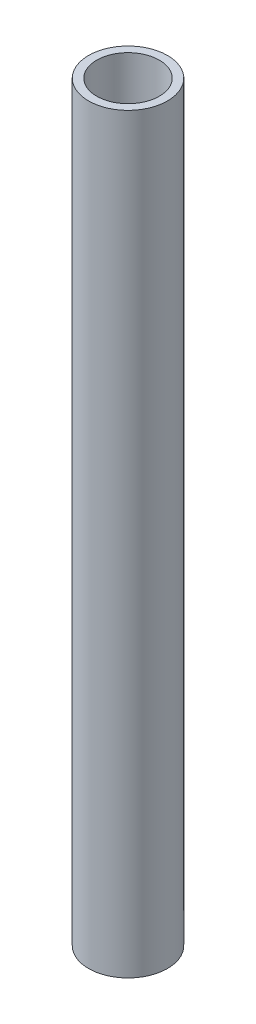
ISO-10303-21;
HEADER;
FILE_DESCRIPTION(('STEP AP214'),'2;1');
FILE_NAME('part.step','',(''),(''),'','','');
FILE_SCHEMA(('AUTOMOTIVE_DESIGN { 1 0 10303 214 1 1 1 1 }'));
ENDSEC;
DATA;
#1=APPLICATION_CONTEXT('core data for automotive mechanical design processes');
#2=APPLICATION_PROTOCOL_DEFINITION('international standard','automotive_design',2000,#1);
#3=PRODUCT_CONTEXT('',#1,'mechanical');
#4=PRODUCT('Part','Part','',(#3));
#5=PRODUCT_RELATED_PRODUCT_CATEGORY('part','',(#4));
#6=PRODUCT_DEFINITION_FORMATION('','',#4);
#7=PRODUCT_DEFINITION_CONTEXT('part definition',#1,'design');
#8=PRODUCT_DEFINITION('design','',#6,#7);
#9=PRODUCT_DEFINITION_SHAPE('','',#8);
#10=(LENGTH_UNIT() NAMED_UNIT(*) SI_UNIT(.MILLI.,.METRE.));
#11=(NAMED_UNIT(*) PLANE_ANGLE_UNIT() SI_UNIT($,.RADIAN.));
#12=(NAMED_UNIT(*) SI_UNIT($,.STERADIAN.) SOLID_ANGLE_UNIT());
#13=UNCERTAINTY_MEASURE_WITH_UNIT(LENGTH_MEASURE(1.E-05),#10,'distance_accuracy_value','');
#14=(GEOMETRIC_REPRESENTATION_CONTEXT(3) GLOBAL_UNCERTAINTY_ASSIGNED_CONTEXT((#13)) GLOBAL_UNIT_ASSIGNED_CONTEXT((#10,
#11,#12)) REPRESENTATION_CONTEXT('',''));
#15=CARTESIAN_POINT('',(0.,0.,0.));
#16=DIRECTION('',(0.,0.,1.));
#17=DIRECTION('',(1.,0.,0.));
#18=AXIS2_PLACEMENT_3D('',#15,#16,#17);
#19=CARTESIAN_POINT('',(0.,152.4,0.));
#20=DIRECTION('',(0.,1.,0.));
#21=DIRECTION('',(0.,0.,1.));
#22=AXIS2_PLACEMENT_3D('',#19,#20,#21);
#23=PLANE('',#22);
#24=CARTESIAN_POINT('',(0.,152.4,0.));
#25=DIRECTION('',(0.,1.,0.));
#26=DIRECTION('',(0.,0.,1.));
#27=AXIS2_PLACEMENT_3D('',#24,#25,#26);
#28=CIRCLE('',#27,8.001);
#29=CARTESIAN_POINT('',(0.,152.4,-8.001));
#30=VERTEX_POINT('',#29);
#31=EDGE_CURVE('E10',#30,#30,#28,.T.);
#32=ORIENTED_EDGE('',*,*,#31,.T.);
#33=EDGE_LOOP('',(#32));
#34=FACE_BOUND('',#33,.T.);
#35=CARTESIAN_POINT('',(0.,152.4,0.));
#36=DIRECTION('',(0.,1.,0.));
#37=DIRECTION('',(0.,0.,1.));
#38=AXIS2_PLACEMENT_3D('',#35,#36,#37);
#39=CIRCLE('',#38,6.35);
#40=CARTESIAN_POINT('',(0.,152.4,-6.35));
#41=VERTEX_POINT('',#40);
#42=EDGE_CURVE('E42',#41,#41,#39,.T.);
#43=ORIENTED_EDGE('',*,*,#42,.F.);
#44=EDGE_LOOP('',(#43));
#45=FACE_BOUND('',#44,.T.);
#46=ADVANCED_FACE('F31',(#34,#45),#23,.T.);
#47=CARTESIAN_POINT('',(0.,0.,0.));
#48=DIRECTION('',(0.,1.,0.));
#49=DIRECTION('',(0.,0.,1.));
#50=AXIS2_PLACEMENT_3D('',#47,#48,#49);
#51=PLANE('',#50);
#52=CARTESIAN_POINT('',(0.,0.,0.));
#53=DIRECTION('',(0.,1.,0.));
#54=DIRECTION('',(0.,0.,1.));
#55=AXIS2_PLACEMENT_3D('',#52,#53,#54);
#56=CIRCLE('',#55,8.001);
#57=CARTESIAN_POINT('',(0.,0.,-8.001));
#58=VERTEX_POINT('',#57);
#59=EDGE_CURVE('E35',#58,#58,#56,.T.);
#60=ORIENTED_EDGE('',*,*,#59,.F.);
#61=EDGE_LOOP('',(#60));
#62=FACE_BOUND('',#61,.T.);
#63=CARTESIAN_POINT('',(0.,0.,0.));
#64=DIRECTION('',(0.,1.,0.));
#65=DIRECTION('',(0.,0.,1.));
#66=AXIS2_PLACEMENT_3D('',#63,#64,#65);
#67=CIRCLE('',#66,6.35);
#68=CARTESIAN_POINT('',(0.,0.,-6.35));
#69=VERTEX_POINT('',#68);
#70=EDGE_CURVE('E44',#69,#69,#67,.T.);
#71=ORIENTED_EDGE('',*,*,#70,.T.);
#72=EDGE_LOOP('',(#71));
#73=FACE_BOUND('',#72,.T.);
#74=ADVANCED_FACE('F54',(#62,#73),#51,.F.);
#75=CARTESIAN_POINT('',(0.,152.4,0.));
#76=DIRECTION('',(0.,-1.,0.));
#77=DIRECTION('',(0.,0.,-1.));
#78=AXIS2_PLACEMENT_3D('',#75,#76,#77);
#79=CYLINDRICAL_SURFACE('',#78,8.001);
#80=CARTESIAN_POINT('',(0.,152.4,-8.001));
#81=CARTESIAN_POINT('',(0.,150.8125,-8.001));
#82=CARTESIAN_POINT('',(0.,149.225,-8.001));
#83=CARTESIAN_POINT('',(0.,146.05,-8.001));
#84=CARTESIAN_POINT('',(0.,144.4625,-8.001));
#85=CARTESIAN_POINT('',(0.,141.2875,-8.001));
#86=CARTESIAN_POINT('',(0.,139.7,-8.001));
#87=CARTESIAN_POINT('',(0.,136.525,-8.001));
#88=CARTESIAN_POINT('',(0.,134.9375,-8.001));
#89=CARTESIAN_POINT('',(0.,131.7625,-8.001));
#90=CARTESIAN_POINT('',(0.,130.175,-8.001));
#91=CARTESIAN_POINT('',(0.,127.,-8.001));
#92=CARTESIAN_POINT('',(0.,125.4125,-8.001));
#93=CARTESIAN_POINT('',(0.,122.2375,-8.001));
#94=CARTESIAN_POINT('',(0.,120.65,-8.001));
#95=CARTESIAN_POINT('',(0.,117.475,-8.001));
#96=CARTESIAN_POINT('',(0.,115.8875,-8.001));
#97=CARTESIAN_POINT('',(0.,112.7125,-8.001));
#98=CARTESIAN_POINT('',(0.,111.125,-8.001));
#99=CARTESIAN_POINT('',(0.,107.95,-8.001));
#100=CARTESIAN_POINT('',(0.,106.3625,-8.001));
#101=CARTESIAN_POINT('',(0.,103.1875,-8.001));
#102=CARTESIAN_POINT('',(0.,101.6,-8.001));
#103=CARTESIAN_POINT('',(0.,98.425,-8.001));
#104=CARTESIAN_POINT('',(0.,96.8375,-8.001));
#105=CARTESIAN_POINT('',(0.,93.6625,-8.001));
#106=CARTESIAN_POINT('',(0.,92.075,-8.001));
#107=CARTESIAN_POINT('',(0.,88.9,-8.001));
#108=CARTESIAN_POINT('',(0.,87.3125,-8.001));
#109=CARTESIAN_POINT('',(0.,84.1375,-8.001));
#110=CARTESIAN_POINT('',(0.,82.55,-8.001));
#111=CARTESIAN_POINT('',(0.,79.375,-8.001));
#112=CARTESIAN_POINT('',(0.,77.7875,-8.001));
#113=CARTESIAN_POINT('',(0.,74.6125,-8.001));
#114=CARTESIAN_POINT('',(0.,73.025,-8.001));
#115=CARTESIAN_POINT('',(0.,69.85,-8.001));
#116=CARTESIAN_POINT('',(0.,68.2625,-8.001));
#117=CARTESIAN_POINT('',(0.,65.0875,-8.001));
#118=CARTESIAN_POINT('',(0.,63.5,-8.001));
#119=CARTESIAN_POINT('',(0.,60.325,-8.001));
#120=CARTESIAN_POINT('',(0.,58.7375,-8.001));
#121=CARTESIAN_POINT('',(0.,55.5625,-8.001));
#122=CARTESIAN_POINT('',(0.,53.975,-8.001));
#123=CARTESIAN_POINT('',(0.,50.8,-8.001));
#124=CARTESIAN_POINT('',(0.,49.2125,-8.001));
#125=CARTESIAN_POINT('',(0.,46.0375,-8.001));
#126=CARTESIAN_POINT('',(0.,44.45,-8.001));
#127=CARTESIAN_POINT('',(0.,41.275,-8.001));
#128=CARTESIAN_POINT('',(0.,39.6875,-8.001));
#129=CARTESIAN_POINT('',(0.,36.5125,-8.001));
#130=CARTESIAN_POINT('',(0.,34.925,-8.001));
#131=CARTESIAN_POINT('',(0.,31.75,-8.001));
#132=CARTESIAN_POINT('',(0.,30.1625,-8.001));
#133=CARTESIAN_POINT('',(0.,26.9875,-8.001));
#134=CARTESIAN_POINT('',(0.,25.4,-8.001));
#135=CARTESIAN_POINT('',(0.,22.225,-8.001));
#136=CARTESIAN_POINT('',(0.,20.6375,-8.001));
#137=CARTESIAN_POINT('',(0.,17.4625,-8.001));
#138=CARTESIAN_POINT('',(0.,15.875,-8.001));
#139=CARTESIAN_POINT('',(0.,12.7,-8.001));
#140=CARTESIAN_POINT('',(0.,11.1125,-8.001));
#141=CARTESIAN_POINT('',(0.,7.93750000000001,-8.001));
#142=CARTESIAN_POINT('',(0.,6.35,-8.001));
#143=CARTESIAN_POINT('',(0.,3.175,-8.001));
#144=CARTESIAN_POINT('',(0.,1.5875,-8.001));
#145=CARTESIAN_POINT('',(0.,0.,-8.001));
#146=B_SPLINE_CURVE_WITH_KNOTS('',3,(#80,#81,#82,#83,#84,#85,#86,#87,#88,#89,#90,#91,#92,#93,
#94,#95,#96,#97,#98,#99,#100,#101,#102,#103,#104,#105,#106,#107,#108,#109,#110,#111,#112,#113,
#114,#115,#116,#117,#118,#119,#120,#121,#122,#123,#124,#125,#126,#127,#128,#129,#130,#131,#132,
#133,#134,#135,#136,#137,#138,#139,#140,#141,#142,#143,#144,#145),.UNSPECIFIED.,.F.,.F.,(4,2,2,
2,2,2,2,2,2,2,2,2,2,2,2,2,2,2,2,2,2,2,2,2,2,2,2,2,2,2,2,2,4),(0.,4.7625,9.52500000000001,
14.2875,19.05,23.8125,28.575,33.3375,38.1,42.8625,47.625,52.3875,57.15,61.9125,66.675,71.4375,
76.2,80.9625,85.725,90.4875,95.25,100.0125,104.775,109.5375,114.3,119.0625,123.825,128.5875,
133.35,138.1125,142.875,147.6375,152.4),.UNSPECIFIED.);
#147=EDGE_CURVE('BSEAM33',#30,#58,#146,.T.);
#148=ORIENTED_EDGE('',*,*,#31,.F.);
#149=ORIENTED_EDGE('',*,*,#59,.T.);
#150=ORIENTED_EDGE('',*,*,#147,.T.);
#151=ORIENTED_EDGE('',*,*,#147,.F.);
#152=EDGE_LOOP('',(#148,#150,#149,#151));
#153=FACE_BOUND('',#152,.T.);
#154=ADVANCED_FACE('F33',(#153),#79,.T.);
#155=CARTESIAN_POINT('',(0.,152.4,0.));
#156=DIRECTION('',(0.,-1.,0.));
#157=DIRECTION('',(0.,0.,-1.));
#158=AXIS2_PLACEMENT_3D('',#155,#156,#157);
#159=CYLINDRICAL_SURFACE('',#158,6.35);
#160=CARTESIAN_POINT('',(0.,152.4,-6.35));
#161=CARTESIAN_POINT('',(0.,150.8125,-6.35));
#162=CARTESIAN_POINT('',(0.,149.225,-6.35));
#163=CARTESIAN_POINT('',(0.,146.05,-6.35));
#164=CARTESIAN_POINT('',(0.,144.4625,-6.35));
#165=CARTESIAN_POINT('',(0.,141.2875,-6.35));
#166=CARTESIAN_POINT('',(0.,139.7,-6.35));
#167=CARTESIAN_POINT('',(0.,136.525,-6.35));
#168=CARTESIAN_POINT('',(0.,134.9375,-6.35));
#169=CARTESIAN_POINT('',(0.,131.7625,-6.35));
#170=CARTESIAN_POINT('',(0.,130.175,-6.35));
#171=CARTESIAN_POINT('',(0.,127.,-6.35));
#172=CARTESIAN_POINT('',(0.,125.4125,-6.35));
#173=CARTESIAN_POINT('',(0.,122.2375,-6.35));
#174=CARTESIAN_POINT('',(0.,120.65,-6.35));
#175=CARTESIAN_POINT('',(0.,117.475,-6.35));
#176=CARTESIAN_POINT('',(0.,115.8875,-6.35));
#177=CARTESIAN_POINT('',(0.,112.7125,-6.35));
#178=CARTESIAN_POINT('',(0.,111.125,-6.35));
#179=CARTESIAN_POINT('',(0.,107.95,-6.35));
#180=CARTESIAN_POINT('',(0.,106.3625,-6.35));
#181=CARTESIAN_POINT('',(0.,103.1875,-6.35));
#182=CARTESIAN_POINT('',(0.,101.6,-6.35));
#183=CARTESIAN_POINT('',(0.,98.425,-6.35));
#184=CARTESIAN_POINT('',(0.,96.8375,-6.35));
#185=CARTESIAN_POINT('',(0.,93.6625,-6.35));
#186=CARTESIAN_POINT('',(0.,92.075,-6.35));
#187=CARTESIAN_POINT('',(0.,88.9,-6.35));
#188=CARTESIAN_POINT('',(0.,87.3125,-6.35));
#189=CARTESIAN_POINT('',(0.,84.1375,-6.35));
#190=CARTESIAN_POINT('',(0.,82.55,-6.35));
#191=CARTESIAN_POINT('',(0.,79.375,-6.35));
#192=CARTESIAN_POINT('',(0.,77.7875,-6.35));
#193=CARTESIAN_POINT('',(0.,74.6125,-6.35));
#194=CARTESIAN_POINT('',(0.,73.025,-6.35));
#195=CARTESIAN_POINT('',(0.,69.85,-6.35));
#196=CARTESIAN_POINT('',(0.,68.2625,-6.35));
#197=CARTESIAN_POINT('',(0.,65.0875,-6.35));
#198=CARTESIAN_POINT('',(0.,63.5,-6.35));
#199=CARTESIAN_POINT('',(0.,60.325,-6.35));
#200=CARTESIAN_POINT('',(0.,58.7375,-6.35));
#201=CARTESIAN_POINT('',(0.,55.5625,-6.35));
#202=CARTESIAN_POINT('',(0.,53.975,-6.35));
#203=CARTESIAN_POINT('',(0.,50.8,-6.35));
#204=CARTESIAN_POINT('',(0.,49.2125,-6.35));
#205=CARTESIAN_POINT('',(0.,46.0375,-6.35));
#206=CARTESIAN_POINT('',(0.,44.45,-6.35));
#207=CARTESIAN_POINT('',(0.,41.275,-6.35));
#208=CARTESIAN_POINT('',(0.,39.6875,-6.35));
#209=CARTESIAN_POINT('',(0.,36.5125,-6.35));
#210=CARTESIAN_POINT('',(0.,34.925,-6.35));
#211=CARTESIAN_POINT('',(0.,31.75,-6.35));
#212=CARTESIAN_POINT('',(0.,30.1625,-6.35));
#213=CARTESIAN_POINT('',(0.,26.9875,-6.35));
#214=CARTESIAN_POINT('',(0.,25.4,-6.35));
#215=CARTESIAN_POINT('',(0.,22.225,-6.35));
#216=CARTESIAN_POINT('',(0.,20.6375,-6.35));
#217=CARTESIAN_POINT('',(0.,17.4625,-6.35));
#218=CARTESIAN_POINT('',(0.,15.875,-6.35));
#219=CARTESIAN_POINT('',(0.,12.7,-6.35));
#220=CARTESIAN_POINT('',(0.,11.1125,-6.35));
#221=CARTESIAN_POINT('',(0.,7.93750000000001,-6.35));
#222=CARTESIAN_POINT('',(0.,6.35,-6.35));
#223=CARTESIAN_POINT('',(0.,3.175,-6.35));
#224=CARTESIAN_POINT('',(0.,1.5875,-6.35));
#225=CARTESIAN_POINT('',(0.,0.,-6.35));
#226=B_SPLINE_CURVE_WITH_KNOTS('',3,(#160,#161,#162,#163,#164,#165,#166,#167,#168,#169,#170,
#171,#172,#173,#174,#175,#176,#177,#178,#179,#180,#181,#182,#183,#184,#185,#186,#187,#188,#189,
#190,#191,#192,#193,#194,#195,#196,#197,#198,#199,#200,#201,#202,#203,#204,#205,#206,#207,#208,
#209,#210,#211,#212,#213,#214,#215,#216,#217,#218,#219,#220,#221,#222,#223,#224,#225),
.UNSPECIFIED.,.F.,.F.,(4,2,2,2,2,2,2,2,2,2,2,2,2,2,2,2,2,2,2,2,2,2,2,2,2,2,2,2,2,2,2,2,4),(0.,
4.7625,9.52500000000001,14.2875,19.05,23.8125,28.575,33.3375,38.1,42.8625,47.625,52.3875,57.15,
61.9125,66.675,71.4375,76.2,80.9625,85.725,90.4875,95.25,100.0125,104.775,109.5375,114.3,
119.0625,123.825,128.5875,133.35,138.1125,142.875,147.6375,152.4),.UNSPECIFIED.);
#227=EDGE_CURVE('BSEAM50',#41,#69,#226,.T.);
#228=ORIENTED_EDGE('',*,*,#42,.T.);
#229=ORIENTED_EDGE('',*,*,#70,.F.);
#230=ORIENTED_EDGE('',*,*,#227,.T.);
#231=ORIENTED_EDGE('',*,*,#227,.F.);
#232=EDGE_LOOP('',(#228,#230,#229,#231));
#233=FACE_BOUND('',#232,.T.);
#234=ADVANCED_FACE('F50',(#233),#159,.F.);
#235=CLOSED_SHELL('',(#46,#74,#154,#234));
#236=MANIFOLD_SOLID_BREP('B2',#235);
#237=ADVANCED_BREP_SHAPE_REPRESENTATION('',(#18,#236),#14);
#238=SHAPE_DEFINITION_REPRESENTATION(#9,#237);
ENDSEC;
END-ISO-10303-21;
